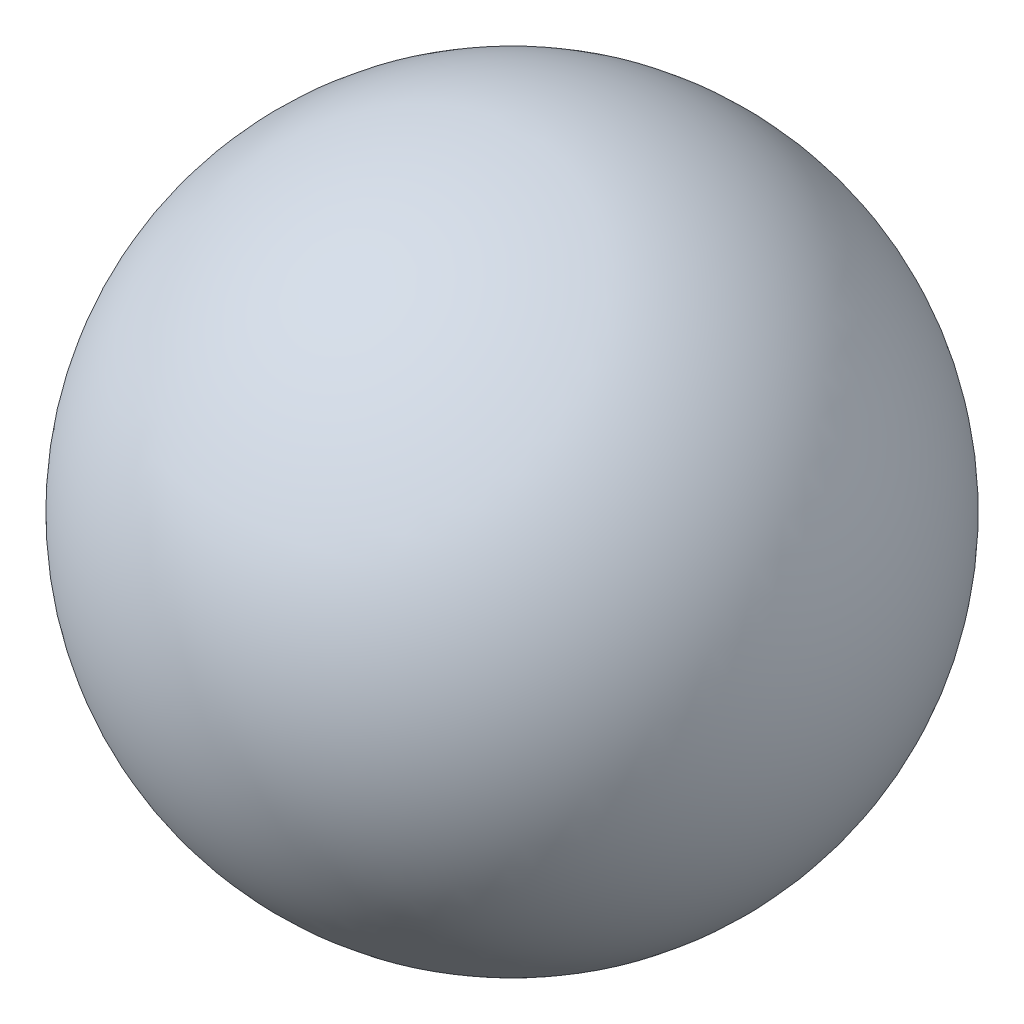
ISO-10303-21;
HEADER;
FILE_DESCRIPTION(('STEP AP214'),'2;1');
FILE_NAME('part.step','',(''),(''),'','','');
FILE_SCHEMA(('AUTOMOTIVE_DESIGN { 1 0 10303 214 1 1 1 1 }'));
ENDSEC;
DATA;
#1=APPLICATION_CONTEXT('core data for automotive mechanical design processes');
#2=APPLICATION_PROTOCOL_DEFINITION('international standard','automotive_design',2000,#1);
#3=PRODUCT_CONTEXT('',#1,'mechanical');
#4=PRODUCT('Part','Part','',(#3));
#5=PRODUCT_RELATED_PRODUCT_CATEGORY('part','',(#4));
#6=PRODUCT_DEFINITION_FORMATION('','',#4);
#7=PRODUCT_DEFINITION_CONTEXT('part definition',#1,'design');
#8=PRODUCT_DEFINITION('design','',#6,#7);
#9=PRODUCT_DEFINITION_SHAPE('','',#8);
#10=(LENGTH_UNIT() NAMED_UNIT(*) SI_UNIT(.MILLI.,.METRE.));
#11=(NAMED_UNIT(*) PLANE_ANGLE_UNIT() SI_UNIT($,.RADIAN.));
#12=(NAMED_UNIT(*) SI_UNIT($,.STERADIAN.) SOLID_ANGLE_UNIT());
#13=UNCERTAINTY_MEASURE_WITH_UNIT(LENGTH_MEASURE(1.E-05),#10,'distance_accuracy_value','');
#14=(GEOMETRIC_REPRESENTATION_CONTEXT(3) GLOBAL_UNCERTAINTY_ASSIGNED_CONTEXT((#13)) GLOBAL_UNIT_ASSIGNED_CONTEXT((#10,
#11,#12)) REPRESENTATION_CONTEXT('',''));
#15=CARTESIAN_POINT('',(0.,0.,0.));
#16=DIRECTION('',(0.,0.,1.));
#17=DIRECTION('',(1.,0.,0.));
#18=AXIS2_PLACEMENT_3D('',#15,#16,#17);
#19=CARTESIAN_POINT('',(0.,0.,0.));
#20=DIRECTION('',(0.,1.,0.));
#21=DIRECTION('',(1.,0.,0.));
#22=AXIS2_PLACEMENT_3D('',#19,#20,#21);
#23=SPHERICAL_SURFACE('',#22,63.5);
#24=CARTESIAN_POINT('',(0.,63.5,0.));
#25=VERTEX_POINT('',#24);
#26=VERTEX_LOOP('',#25);
#27=FACE_BOUND('',#26,.T.);
#28=ADVANCED_FACE('F28',(#27),#23,.T.);
#29=CLOSED_SHELL('',(#28));
#30=MANIFOLD_SOLID_BREP('B2',#29);
#31=ADVANCED_BREP_SHAPE_REPRESENTATION('',(#18,#30),#14);
#32=SHAPE_DEFINITION_REPRESENTATION(#9,#31);
ENDSEC;
END-ISO-10303-21;
